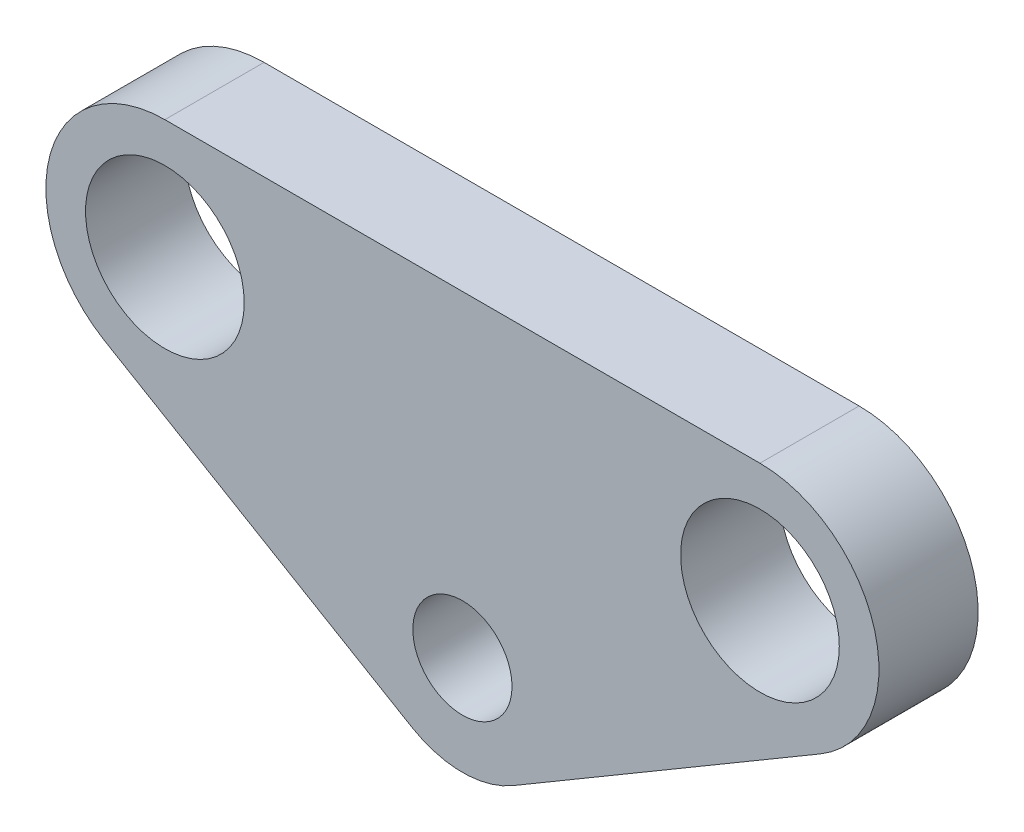
ISO-10303-21;
HEADER;
FILE_DESCRIPTION(('STEP AP214'),'2;1');
FILE_NAME('part.step','',(''),(''),'','','');
FILE_SCHEMA(('AUTOMOTIVE_DESIGN { 1 0 10303 214 1 1 1 1 }'));
ENDSEC;
DATA;
#1=APPLICATION_CONTEXT('core data for automotive mechanical design processes');
#2=APPLICATION_PROTOCOL_DEFINITION('international standard','automotive_design',2000,#1);
#3=PRODUCT_CONTEXT('',#1,'mechanical');
#4=PRODUCT('Part','Part','',(#3));
#5=PRODUCT_RELATED_PRODUCT_CATEGORY('part','',(#4));
#6=PRODUCT_DEFINITION_FORMATION('','',#4);
#7=PRODUCT_DEFINITION_CONTEXT('part definition',#1,'design');
#8=PRODUCT_DEFINITION('design','',#6,#7);
#9=PRODUCT_DEFINITION_SHAPE('','',#8);
#10=(LENGTH_UNIT() NAMED_UNIT(*) SI_UNIT(.MILLI.,.METRE.));
#11=(NAMED_UNIT(*) PLANE_ANGLE_UNIT() SI_UNIT($,.RADIAN.));
#12=(NAMED_UNIT(*) SI_UNIT($,.STERADIAN.) SOLID_ANGLE_UNIT());
#13=UNCERTAINTY_MEASURE_WITH_UNIT(LENGTH_MEASURE(1.E-05),#10,'distance_accuracy_value','');
#14=(GEOMETRIC_REPRESENTATION_CONTEXT(3) GLOBAL_UNCERTAINTY_ASSIGNED_CONTEXT((#13)) GLOBAL_UNIT_ASSIGNED_CONTEXT((#10,
#11,#12)) REPRESENTATION_CONTEXT('',''));
#15=CARTESIAN_POINT('',(0.,0.,0.));
#16=DIRECTION('',(0.,0.,1.));
#17=DIRECTION('',(1.,0.,0.));
#18=AXIS2_PLACEMENT_3D('',#15,#16,#17);
#19=CARTESIAN_POINT('',(-2.53846153846154,-4.30769230769231,5.));
#20=DIRECTION('',(0.507692307692308,0.861538461538461,0.));
#21=DIRECTION('',(-0.861538461538461,0.507692307692308,0.));
#22=AXIS2_PLACEMENT_3D('',#19,#20,#21);
#23=PLANE('',#22);
#24=DIRECTION('',(0.861538461538461,-0.507692307692308,0.));
#25=VECTOR('',#24,1.);
#26=CARTESIAN_POINT('',(-2.53846153846154,-4.30769230769231,0.));
#27=LINE('',#26,#25);
#28=CARTESIAN_POINT('',(-18.0461538461538,4.83076923076923,0.));
#29=VERTEX_POINT('',#28);
#30=CARTESIAN_POINT('',(-2.53846153846154,-4.30769230769231,0.));
#31=VERTEX_POINT('',#30);
#32=EDGE_CURVE('E129',#29,#31,#27,.T.);
#33=ORIENTED_EDGE('',*,*,#32,.T.);
#34=DIRECTION('',(0.,0.,-1.));
#35=VECTOR('',#34,1.);
#36=CARTESIAN_POINT('',(-2.53846153846154,-4.30769230769231,5.));
#37=LINE('',#36,#35);
#38=CARTESIAN_POINT('',(-2.53846153846154,-4.30769230769231,5.));
#39=VERTEX_POINT('',#38);
#40=EDGE_CURVE('E11',#39,#31,#37,.T.);
#41=ORIENTED_EDGE('',*,*,#40,.F.);
#42=DIRECTION('',(0.861538461538461,-0.507692307692308,0.));
#43=VECTOR('',#42,1.);
#44=CARTESIAN_POINT('',(-2.53846153846154,-4.30769230769231,5.));
#45=LINE('',#44,#43);
#46=CARTESIAN_POINT('',(-18.0461538461538,4.83076923076923,5.));
#47=VERTEX_POINT('',#46);
#48=EDGE_CURVE('E262',#47,#39,#45,.T.);
#49=ORIENTED_EDGE('',*,*,#48,.F.);
#50=DIRECTION('',(0.,0.,-1.));
#51=VECTOR('',#50,1.);
#52=CARTESIAN_POINT('',(-18.0461538461538,4.83076923076923,5.));
#53=LINE('',#52,#51);
#54=EDGE_CURVE('E52',#47,#29,#53,.T.);
#55=ORIENTED_EDGE('',*,*,#54,.T.);
#56=EDGE_LOOP('',(#33,#41,#49,#55));
#57=FACE_BOUND('',#56,.T.);
#58=ADVANCED_FACE('F35',(#57),#23,.F.);
#59=CARTESIAN_POINT('',(0.,0.,5.));
#60=DIRECTION('',(0.,0.,-1.));
#61=DIRECTION('',(-1.,0.,0.));
#62=AXIS2_PLACEMENT_3D('',#59,#60,#61);
#63=CYLINDRICAL_SURFACE('',#62,5.);
#64=CARTESIAN_POINT('',(0.,0.,0.));
#65=DIRECTION('',(0.,0.,1.));
#66=DIRECTION('',(1.,0.,0.));
#67=AXIS2_PLACEMENT_3D('',#64,#65,#66);
#68=CIRCLE('',#67,5.);
#69=CARTESIAN_POINT('',(2.53846153846154,-4.30769230769231,0.));
#70=VERTEX_POINT('',#69);
#71=EDGE_CURVE('E131',#31,#70,#68,.T.);
#72=ORIENTED_EDGE('',*,*,#71,.T.);
#73=DIRECTION('',(0.,0.,-1.));
#74=VECTOR('',#73,1.);
#75=CARTESIAN_POINT('',(2.53846153846154,-4.30769230769231,5.));
#76=LINE('',#75,#74);
#77=CARTESIAN_POINT('',(2.53846153846154,-4.30769230769231,5.));
#78=VERTEX_POINT('',#77);
#79=EDGE_CURVE('E44',#78,#70,#76,.T.);
#80=ORIENTED_EDGE('',*,*,#79,.F.);
#81=CARTESIAN_POINT('',(0.,0.,5.));
#82=DIRECTION('',(0.,0.,1.));
#83=DIRECTION('',(1.,0.,0.));
#84=AXIS2_PLACEMENT_3D('',#81,#82,#83);
#85=CIRCLE('',#84,5.);
#86=EDGE_CURVE('E84',#39,#78,#85,.T.);
#87=ORIENTED_EDGE('',*,*,#86,.F.);
#88=ORIENTED_EDGE('',*,*,#40,.T.);
#89=EDGE_LOOP('',(#72,#80,#87,#88));
#90=FACE_BOUND('',#89,.T.);
#91=ADVANCED_FACE('F149',(#90),#63,.T.);
#92=CARTESIAN_POINT('',(2.53846153846154,-4.30769230769231,5.));
#93=DIRECTION('',(0.507692307692308,-0.861538461538461,0.));
#94=DIRECTION('',(0.861538461538461,0.507692307692308,0.));
#95=AXIS2_PLACEMENT_3D('',#92,#93,#94);
#96=PLANE('',#95);
#97=DIRECTION('',(-0.861538461538461,-0.507692307692308,0.));
#98=VECTOR('',#97,1.);
#99=CARTESIAN_POINT('',(2.53846153846154,-4.30769230769231,0.));
#100=LINE('',#99,#98);
#101=CARTESIAN_POINT('',(18.0461538461538,4.83076923076923,0.));
#102=VERTEX_POINT('',#101);
#103=EDGE_CURVE('E134',#102,#70,#100,.T.);
#104=ORIENTED_EDGE('',*,*,#103,.F.);
#105=DIRECTION('',(0.,0.,-1.));
#106=VECTOR('',#105,1.);
#107=CARTESIAN_POINT('',(18.0461538461538,4.83076923076923,5.));
#108=LINE('',#107,#106);
#109=CARTESIAN_POINT('',(18.0461538461538,4.83076923076923,5.));
#110=VERTEX_POINT('',#109);
#111=EDGE_CURVE('E112',#110,#102,#108,.T.);
#112=ORIENTED_EDGE('',*,*,#111,.F.);
#113=DIRECTION('',(-0.861538461538461,-0.507692307692308,0.));
#114=VECTOR('',#113,1.);
#115=CARTESIAN_POINT('',(2.53846153846154,-4.30769230769231,5.));
#116=LINE('',#115,#114);
#117=EDGE_CURVE('E102',#110,#78,#116,.T.);
#118=ORIENTED_EDGE('',*,*,#117,.T.);
#119=ORIENTED_EDGE('',*,*,#79,.T.);
#120=EDGE_LOOP('',(#104,#112,#118,#119));
#121=FACE_BOUND('',#120,.T.);
#122=ADVANCED_FACE('F148',(#121),#96,.T.);
#123=CARTESIAN_POINT('',(15.,10.,5.));
#124=DIRECTION('',(0.,0.,-1.));
#125=DIRECTION('',(-1.,0.,0.));
#126=AXIS2_PLACEMENT_3D('',#123,#124,#125);
#127=CYLINDRICAL_SURFACE('',#126,6.);
#128=CARTESIAN_POINT('',(15.,10.,0.));
#129=DIRECTION('',(0.,0.,1.));
#130=DIRECTION('',(1.,0.,0.));
#131=AXIS2_PLACEMENT_3D('',#128,#129,#130);
#132=CIRCLE('',#131,6.);
#133=CARTESIAN_POINT('',(15.,16.,0.));
#134=VERTEX_POINT('',#133);
#135=EDGE_CURVE('E109',#102,#134,#132,.T.);
#136=ORIENTED_EDGE('',*,*,#135,.T.);
#137=DIRECTION('',(0.,0.,-1.));
#138=VECTOR('',#137,1.);
#139=CARTESIAN_POINT('',(15.,16.,5.));
#140=LINE('',#139,#138);
#141=CARTESIAN_POINT('',(15.,16.,5.));
#142=VERTEX_POINT('',#141);
#143=EDGE_CURVE('E106',#142,#134,#140,.T.);
#144=ORIENTED_EDGE('',*,*,#143,.F.);
#145=CARTESIAN_POINT('',(15.,10.,5.));
#146=DIRECTION('',(0.,0.,1.));
#147=DIRECTION('',(1.,0.,0.));
#148=AXIS2_PLACEMENT_3D('',#145,#146,#147);
#149=CIRCLE('',#148,6.);
#150=EDGE_CURVE('E95',#110,#142,#149,.T.);
#151=ORIENTED_EDGE('',*,*,#150,.F.);
#152=ORIENTED_EDGE('',*,*,#111,.T.);
#153=EDGE_LOOP('',(#136,#144,#151,#152));
#154=FACE_BOUND('',#153,.T.);
#155=ADVANCED_FACE('F107',(#154),#127,.T.);
#156=CARTESIAN_POINT('',(0.,16.,5.));
#157=DIRECTION('',(0.,1.,0.));
#158=DIRECTION('',(0.,0.,1.));
#159=AXIS2_PLACEMENT_3D('',#156,#157,#158);
#160=PLANE('',#159);
#161=DIRECTION('',(1.,0.,0.));
#162=VECTOR('',#161,1.);
#163=CARTESIAN_POINT('',(0.,16.,0.));
#164=LINE('',#163,#162);
#165=CARTESIAN_POINT('',(-15.,16.,0.));
#166=VERTEX_POINT('',#165);
#167=EDGE_CURVE('E138',#166,#134,#164,.T.);
#168=ORIENTED_EDGE('',*,*,#167,.F.);
#169=DIRECTION('',(0.,0.,-1.));
#170=VECTOR('',#169,1.);
#171=CARTESIAN_POINT('',(-15.,16.,5.));
#172=LINE('',#171,#170);
#173=CARTESIAN_POINT('',(-15.,16.,5.));
#174=VERTEX_POINT('',#173);
#175=EDGE_CURVE('E72',#174,#166,#172,.T.);
#176=ORIENTED_EDGE('',*,*,#175,.F.);
#177=DIRECTION('',(1.,0.,0.));
#178=VECTOR('',#177,1.);
#179=CARTESIAN_POINT('',(0.,16.,5.));
#180=LINE('',#179,#178);
#181=EDGE_CURVE('E100',#174,#142,#180,.T.);
#182=ORIENTED_EDGE('',*,*,#181,.T.);
#183=ORIENTED_EDGE('',*,*,#143,.T.);
#184=EDGE_LOOP('',(#168,#176,#182,#183));
#185=FACE_BOUND('',#184,.T.);
#186=ADVANCED_FACE('F114',(#185),#160,.T.);
#187=CARTESIAN_POINT('',(0.,0.,5.));
#188=DIRECTION('',(0.,0.,-1.));
#189=DIRECTION('',(-1.,0.,0.));
#190=AXIS2_PLACEMENT_3D('',#187,#188,#189);
#191=CYLINDRICAL_SURFACE('',#190,2.5);
#192=CARTESIAN_POINT('',(0.,0.,5.));
#193=DIRECTION('',(0.,0.,1.));
#194=DIRECTION('',(1.,0.,0.));
#195=AXIS2_PLACEMENT_3D('',#192,#193,#194);
#196=CIRCLE('',#195,2.5);
#197=CARTESIAN_POINT('',(2.5,0.,5.));
#198=VERTEX_POINT('',#197);
#199=EDGE_CURVE('E259',#198,#198,#196,.T.);
#200=ORIENTED_EDGE('',*,*,#199,.T.);
#201=EDGE_LOOP('',(#200));
#202=FACE_BOUND('',#201,.T.);
#203=CARTESIAN_POINT('',(0.,0.,0.));
#204=DIRECTION('',(0.,0.,1.));
#205=DIRECTION('',(1.,0.,0.));
#206=AXIS2_PLACEMENT_3D('',#203,#204,#205);
#207=CIRCLE('',#206,2.5);
#208=CARTESIAN_POINT('',(2.5,0.,0.));
#209=VERTEX_POINT('',#208);
#210=EDGE_CURVE('E126',#209,#209,#207,.T.);
#211=ORIENTED_EDGE('',*,*,#210,.F.);
#212=EDGE_LOOP('',(#211));
#213=FACE_BOUND('',#212,.T.);
#214=ADVANCED_FACE('F174',(#202,#213),#191,.F.);
#215=CARTESIAN_POINT('',(-15.,10.,5.));
#216=DIRECTION('',(0.,0.,-1.));
#217=DIRECTION('',(-1.,0.,0.));
#218=AXIS2_PLACEMENT_3D('',#215,#216,#217);
#219=CYLINDRICAL_SURFACE('',#218,4.);
#220=CARTESIAN_POINT('',(-15.,10.,5.));
#221=DIRECTION('',(0.,0.,1.));
#222=DIRECTION('',(1.,0.,0.));
#223=AXIS2_PLACEMENT_3D('',#220,#221,#222);
#224=CIRCLE('',#223,4.);
#225=CARTESIAN_POINT('',(-11.,10.,5.));
#226=VERTEX_POINT('',#225);
#227=EDGE_CURVE('E184',#226,#226,#224,.T.);
#228=ORIENTED_EDGE('',*,*,#227,.T.);
#229=EDGE_LOOP('',(#228));
#230=FACE_BOUND('',#229,.T.);
#231=CARTESIAN_POINT('',(-15.,10.,0.));
#232=DIRECTION('',(0.,0.,1.));
#233=DIRECTION('',(1.,0.,0.));
#234=AXIS2_PLACEMENT_3D('',#231,#232,#233);
#235=CIRCLE('',#234,4.);
#236=CARTESIAN_POINT('',(-11.,10.,0.));
#237=VERTEX_POINT('',#236);
#238=EDGE_CURVE('E123',#237,#237,#235,.T.);
#239=ORIENTED_EDGE('',*,*,#238,.F.);
#240=EDGE_LOOP('',(#239));
#241=FACE_BOUND('',#240,.T.);
#242=ADVANCED_FACE('F162',(#230,#241),#219,.F.);
#243=CARTESIAN_POINT('',(15.,10.,5.));
#244=DIRECTION('',(0.,0.,-1.));
#245=DIRECTION('',(-1.,0.,0.));
#246=AXIS2_PLACEMENT_3D('',#243,#244,#245);
#247=CYLINDRICAL_SURFACE('',#246,4.);
#248=CARTESIAN_POINT('',(15.,10.,5.));
#249=DIRECTION('',(0.,0.,1.));
#250=DIRECTION('',(1.,0.,0.));
#251=AXIS2_PLACEMENT_3D('',#248,#249,#250);
#252=CIRCLE('',#251,4.);
#253=CARTESIAN_POINT('',(19.,10.,5.));
#254=VERTEX_POINT('',#253);
#255=EDGE_CURVE('E143',#254,#254,#252,.F.);
#256=ORIENTED_EDGE('',*,*,#255,.F.);
#257=EDGE_LOOP('',(#256));
#258=FACE_BOUND('',#257,.T.);
#259=CARTESIAN_POINT('',(15.,10.,0.));
#260=DIRECTION('',(0.,0.,1.));
#261=DIRECTION('',(1.,0.,0.));
#262=AXIS2_PLACEMENT_3D('',#259,#260,#261);
#263=CIRCLE('',#262,4.);
#264=CARTESIAN_POINT('',(19.,10.,0.));
#265=VERTEX_POINT('',#264);
#266=EDGE_CURVE('E120',#265,#265,#263,.F.);
#267=ORIENTED_EDGE('',*,*,#266,.T.);
#268=EDGE_LOOP('',(#267));
#269=FACE_BOUND('',#268,.T.);
#270=ADVANCED_FACE('F37',(#258,#269),#247,.F.);
#271=CARTESIAN_POINT('',(-15.,10.,5.));
#272=DIRECTION('',(0.,0.,-1.));
#273=DIRECTION('',(-1.,0.,0.));
#274=AXIS2_PLACEMENT_3D('',#271,#272,#273);
#275=CYLINDRICAL_SURFACE('',#274,6.);
#276=CARTESIAN_POINT('',(-15.,10.,0.));
#277=DIRECTION('',(0.,0.,1.));
#278=DIRECTION('',(1.,0.,0.));
#279=AXIS2_PLACEMENT_3D('',#276,#277,#278);
#280=CIRCLE('',#279,6.);
#281=EDGE_CURVE('E140',#29,#166,#280,.F.);
#282=ORIENTED_EDGE('',*,*,#281,.F.);
#283=ORIENTED_EDGE('',*,*,#54,.F.);
#284=CARTESIAN_POINT('',(-15.,10.,5.));
#285=DIRECTION('',(0.,0.,1.));
#286=DIRECTION('',(1.,0.,0.));
#287=AXIS2_PLACEMENT_3D('',#284,#285,#286);
#288=CIRCLE('',#287,6.);
#289=EDGE_CURVE('E115',#47,#174,#288,.F.);
#290=ORIENTED_EDGE('',*,*,#289,.T.);
#291=ORIENTED_EDGE('',*,*,#175,.T.);
#292=EDGE_LOOP('',(#282,#283,#290,#291));
#293=FACE_BOUND('',#292,.T.);
#294=ADVANCED_FACE('F153',(#293),#275,.T.);
#295=CARTESIAN_POINT('',(0.,0.,5.));
#296=DIRECTION('',(0.,0.,1.));
#297=DIRECTION('',(1.,0.,0.));
#298=AXIS2_PLACEMENT_3D('',#295,#296,#297);
#299=PLANE('',#298);
#300=ORIENTED_EDGE('',*,*,#255,.T.);
#301=EDGE_LOOP('',(#300));
#302=FACE_BOUND('',#301,.T.);
#303=ORIENTED_EDGE('',*,*,#227,.F.);
#304=EDGE_LOOP('',(#303));
#305=FACE_BOUND('',#304,.T.);
#306=ORIENTED_EDGE('',*,*,#199,.F.);
#307=EDGE_LOOP('',(#306));
#308=FACE_BOUND('',#307,.T.);
#309=ORIENTED_EDGE('',*,*,#48,.T.);
#310=ORIENTED_EDGE('',*,*,#86,.T.);
#311=ORIENTED_EDGE('',*,*,#117,.F.);
#312=ORIENTED_EDGE('',*,*,#150,.T.);
#313=ORIENTED_EDGE('',*,*,#181,.F.);
#314=ORIENTED_EDGE('',*,*,#289,.F.);
#315=EDGE_LOOP('',(#309,#310,#311,#312,#313,#314));
#316=FACE_BOUND('',#315,.T.);
#317=ADVANCED_FACE('F97',(#302,#305,#308,#316),#299,.T.);
#318=CARTESIAN_POINT('',(0.,0.,0.));
#319=DIRECTION('',(0.,0.,1.));
#320=DIRECTION('',(1.,0.,0.));
#321=AXIS2_PLACEMENT_3D('',#318,#319,#320);
#322=PLANE('',#321);
#323=ORIENTED_EDGE('',*,*,#266,.F.);
#324=EDGE_LOOP('',(#323));
#325=FACE_BOUND('',#324,.T.);
#326=ORIENTED_EDGE('',*,*,#238,.T.);
#327=EDGE_LOOP('',(#326));
#328=FACE_BOUND('',#327,.T.);
#329=ORIENTED_EDGE('',*,*,#210,.T.);
#330=EDGE_LOOP('',(#329));
#331=FACE_BOUND('',#330,.T.);
#332=ORIENTED_EDGE('',*,*,#32,.F.);
#333=ORIENTED_EDGE('',*,*,#281,.T.);
#334=ORIENTED_EDGE('',*,*,#167,.T.);
#335=ORIENTED_EDGE('',*,*,#135,.F.);
#336=ORIENTED_EDGE('',*,*,#103,.T.);
#337=ORIENTED_EDGE('',*,*,#71,.F.);
#338=EDGE_LOOP('',(#332,#333,#334,#335,#336,#337));
#339=FACE_BOUND('',#338,.T.);
#340=ADVANCED_FACE('F152',(#325,#328,#331,#339),#322,.F.);
#341=CLOSED_SHELL('',(#58,#91,#122,#155,#186,#214,#242,#270,#294,#317,#340));
#342=MANIFOLD_SOLID_BREP('B2',#341);
#343=ADVANCED_BREP_SHAPE_REPRESENTATION('',(#18,#342),#14);
#344=SHAPE_DEFINITION_REPRESENTATION(#9,#343);
ENDSEC;
END-ISO-10303-21;
